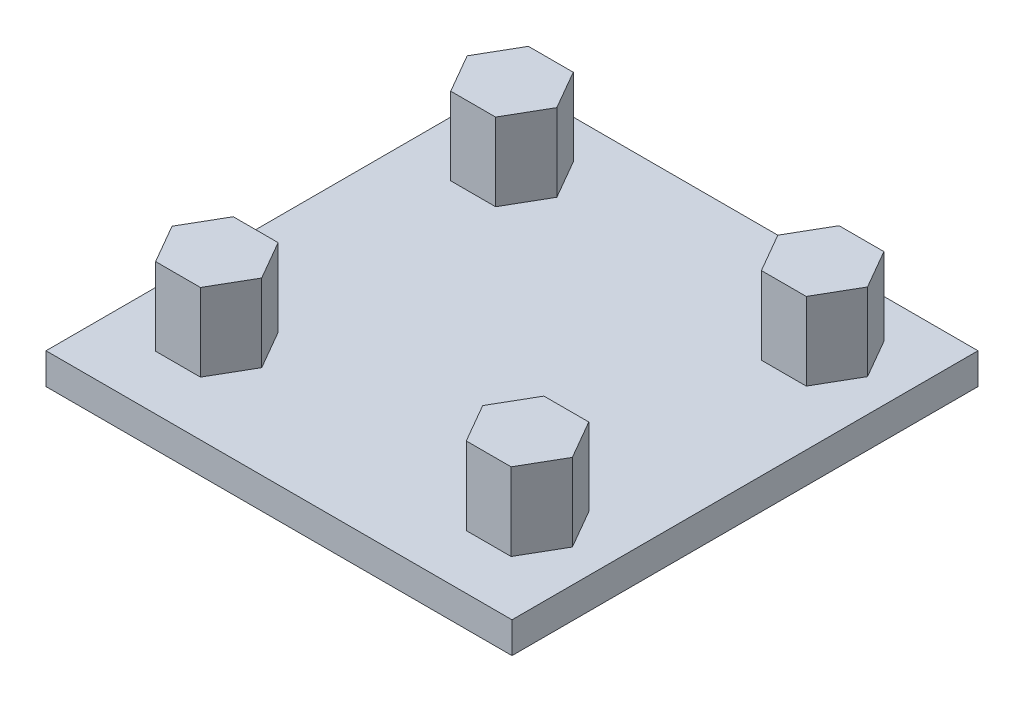
ISO-10303-21;
HEADER;
FILE_DESCRIPTION(('STEP AP214'),'2;1');
FILE_NAME('part.step','',(''),(''),'','','');
FILE_SCHEMA(('AUTOMOTIVE_DESIGN { 1 0 10303 214 1 1 1 1 }'));
ENDSEC;
DATA;
#1=APPLICATION_CONTEXT('core data for automotive mechanical design processes');
#2=APPLICATION_PROTOCOL_DEFINITION('international standard','automotive_design',2000,#1);
#3=PRODUCT_CONTEXT('',#1,'mechanical');
#4=PRODUCT('Part','Part','',(#3));
#5=PRODUCT_RELATED_PRODUCT_CATEGORY('part','',(#4));
#6=PRODUCT_DEFINITION_FORMATION('','',#4);
#7=PRODUCT_DEFINITION_CONTEXT('part definition',#1,'design');
#8=PRODUCT_DEFINITION('design','',#6,#7);
#9=PRODUCT_DEFINITION_SHAPE('','',#8);
#10=(LENGTH_UNIT() NAMED_UNIT(*) SI_UNIT(.MILLI.,.METRE.));
#11=(NAMED_UNIT(*) PLANE_ANGLE_UNIT() SI_UNIT($,.RADIAN.));
#12=(NAMED_UNIT(*) SI_UNIT($,.STERADIAN.) SOLID_ANGLE_UNIT());
#13=UNCERTAINTY_MEASURE_WITH_UNIT(LENGTH_MEASURE(1.E-05),#10,'distance_accuracy_value','');
#14=(GEOMETRIC_REPRESENTATION_CONTEXT(3) GLOBAL_UNCERTAINTY_ASSIGNED_CONTEXT((#13)) GLOBAL_UNIT_ASSIGNED_CONTEXT((#10,
#11,#12)) REPRESENTATION_CONTEXT('',''));
#15=CARTESIAN_POINT('',(0.,0.,0.));
#16=DIRECTION('',(0.,0.,1.));
#17=DIRECTION('',(1.,0.,0.));
#18=AXIS2_PLACEMENT_3D('',#15,#16,#17);
#19=CARTESIAN_POINT('',(50.8,17.78,48.26));
#20=DIRECTION('',(0.,1.,0.));
#21=DIRECTION('',(0.,0.,1.));
#22=AXIS2_PLACEMENT_3D('',#19,#20,#21);
#23=PLANE('',#22);
#24=DIRECTION('',(1.,0.,0.));
#25=VECTOR('',#24,1.);
#26=CARTESIAN_POINT('',(21.7338257906459,17.78,29.21));
#27=LINE('',#26,#25);
#28=CARTESIAN_POINT('',(21.7338257906459,17.78,29.21));
#29=VERTEX_POINT('',#28);
#30=CARTESIAN_POINT('',(29.0661742093541,17.78,29.21));
#31=VERTEX_POINT('',#30);
#32=EDGE_CURVE('E467',#29,#31,#27,.T.);
#33=ORIENTED_EDGE('',*,*,#32,.T.);
#34=DIRECTION('',(0.5,0.,-0.866025403784439));
#35=VECTOR('',#34,1.);
#36=CARTESIAN_POINT('',(29.0661742093541,17.78,29.21));
#37=LINE('',#36,#35);
#38=CARTESIAN_POINT('',(32.7323484187082,17.78,22.86));
#39=VERTEX_POINT('',#38);
#40=EDGE_CURVE('E479',#31,#39,#37,.T.);
#41=ORIENTED_EDGE('',*,*,#40,.T.);
#42=DIRECTION('',(-0.5,0.,-0.866025403784439));
#43=VECTOR('',#42,1.);
#44=CARTESIAN_POINT('',(32.7323484187082,17.78,22.86));
#45=LINE('',#44,#43);
#46=CARTESIAN_POINT('',(29.0661742093541,17.78,16.51));
#47=VERTEX_POINT('',#46);
#48=EDGE_CURVE('E487',#39,#47,#45,.T.);
#49=ORIENTED_EDGE('',*,*,#48,.T.);
#50=DIRECTION('',(-1.,0.,0.));
#51=VECTOR('',#50,1.);
#52=CARTESIAN_POINT('',(29.0661742093541,17.78,16.51));
#53=LINE('',#52,#51);
#54=CARTESIAN_POINT('',(21.7338257906459,17.78,16.51));
#55=VERTEX_POINT('',#54);
#56=EDGE_CURVE('E493',#47,#55,#53,.T.);
#57=ORIENTED_EDGE('',*,*,#56,.T.);
#58=DIRECTION('',(-0.5,0.,0.866025403784438));
#59=VECTOR('',#58,1.);
#60=CARTESIAN_POINT('',(21.7338257906459,17.78,16.51));
#61=LINE('',#60,#59);
#62=CARTESIAN_POINT('',(18.0676515812918,17.78,22.86));
#63=VERTEX_POINT('',#62);
#64=EDGE_CURVE('E51',#55,#63,#61,.T.);
#65=ORIENTED_EDGE('',*,*,#64,.T.);
#66=DIRECTION('',(0.5,0.,0.866025403784439));
#67=VECTOR('',#66,1.);
#68=CARTESIAN_POINT('',(18.0676515812918,17.78,22.86));
#69=LINE('',#68,#67);
#70=EDGE_CURVE('E11',#63,#29,#69,.T.);
#71=ORIENTED_EDGE('',*,*,#70,.T.);
#72=EDGE_LOOP('',(#33,#41,#49,#57,#65,#71));
#73=FACE_BOUND('',#72,.T.);
#74=ADVANCED_FACE('F43',(#73),#23,.T.);
#75=CARTESIAN_POINT('',(18.0676515812918,17.78,22.86));
#76=DIRECTION('',(0.866025403784439,0.,-0.5));
#77=DIRECTION('',(-0.5,0.,-0.866025403784439));
#78=AXIS2_PLACEMENT_3D('',#75,#76,#77);
#79=PLANE('',#78);
#80=DIRECTION('',(0.5,0.,0.866025403784439));
#81=VECTOR('',#80,1.);
#82=CARTESIAN_POINT('',(18.0676515812918,5.08,22.86));
#83=LINE('',#82,#81);
#84=CARTESIAN_POINT('',(18.0676515812918,5.08,22.86));
#85=VERTEX_POINT('',#84);
#86=CARTESIAN_POINT('',(21.7338257906459,5.08,29.21));
#87=VERTEX_POINT('',#86);
#88=EDGE_CURVE('E445',#85,#87,#83,.T.);
#89=ORIENTED_EDGE('',*,*,#88,.T.);
#90=DIRECTION('',(0.,-1.,0.));
#91=VECTOR('',#90,1.);
#92=CARTESIAN_POINT('',(21.7338257906459,17.78,29.21));
#93=LINE('',#92,#91);
#94=EDGE_CURVE('E471',#29,#87,#93,.T.);
#95=ORIENTED_EDGE('',*,*,#94,.F.);
#96=ORIENTED_EDGE('',*,*,#70,.F.);
#97=DIRECTION('',(0.,-1.,0.));
#98=VECTOR('',#97,1.);
#99=CARTESIAN_POINT('',(18.0676515812918,17.78,22.86));
#100=LINE('',#99,#98);
#101=EDGE_CURVE('E58',#63,#85,#100,.T.);
#102=ORIENTED_EDGE('',*,*,#101,.T.);
#103=EDGE_LOOP('',(#89,#95,#96,#102));
#104=FACE_BOUND('',#103,.T.);
#105=ADVANCED_FACE('F502',(#104),#79,.F.);
#106=CARTESIAN_POINT('',(21.7338257906459,17.78,16.51));
#107=DIRECTION('',(0.866025403784438,0.,0.5));
#108=DIRECTION('',(0.5,0.,-0.866025403784439));
#109=AXIS2_PLACEMENT_3D('',#106,#107,#108);
#110=PLANE('',#109);
#111=DIRECTION('',(-0.5,0.,0.866025403784438));
#112=VECTOR('',#111,1.);
#113=CARTESIAN_POINT('',(21.7338257906459,5.08,16.51));
#114=LINE('',#113,#112);
#115=CARTESIAN_POINT('',(21.7338257906459,5.08,16.51));
#116=VERTEX_POINT('',#115);
#117=EDGE_CURVE('E449',#116,#85,#114,.T.);
#118=ORIENTED_EDGE('',*,*,#117,.T.);
#119=ORIENTED_EDGE('',*,*,#101,.F.);
#120=ORIENTED_EDGE('',*,*,#64,.F.);
#121=DIRECTION('',(0.,-1.,0.));
#122=VECTOR('',#121,1.);
#123=CARTESIAN_POINT('',(21.7338257906459,17.78,16.51));
#124=LINE('',#123,#122);
#125=EDGE_CURVE('E66',#55,#116,#124,.T.);
#126=ORIENTED_EDGE('',*,*,#125,.T.);
#127=EDGE_LOOP('',(#118,#119,#120,#126));
#128=FACE_BOUND('',#127,.T.);
#129=ADVANCED_FACE('F514',(#128),#110,.F.);
#130=CARTESIAN_POINT('',(29.0661742093541,17.78,16.51));
#131=DIRECTION('',(0.,0.,1.));
#132=DIRECTION('',(1.,0.,0.));
#133=AXIS2_PLACEMENT_3D('',#130,#131,#132);
#134=PLANE('',#133);
#135=DIRECTION('',(-1.,0.,0.));
#136=VECTOR('',#135,1.);
#137=CARTESIAN_POINT('',(29.0661742093541,5.08,16.51));
#138=LINE('',#137,#136);
#139=CARTESIAN_POINT('',(29.0661742093541,5.08,16.51));
#140=VERTEX_POINT('',#139);
#141=EDGE_CURVE('E452',#140,#116,#138,.T.);
#142=ORIENTED_EDGE('',*,*,#141,.T.);
#143=ORIENTED_EDGE('',*,*,#125,.F.);
#144=ORIENTED_EDGE('',*,*,#56,.F.);
#145=DIRECTION('',(0.,-1.,0.));
#146=VECTOR('',#145,1.);
#147=CARTESIAN_POINT('',(29.0661742093541,17.78,16.51));
#148=LINE('',#147,#146);
#149=EDGE_CURVE('E483',#47,#140,#148,.T.);
#150=ORIENTED_EDGE('',*,*,#149,.T.);
#151=EDGE_LOOP('',(#142,#143,#144,#150));
#152=FACE_BOUND('',#151,.T.);
#153=ADVANCED_FACE('F512',(#152),#134,.F.);
#154=CARTESIAN_POINT('',(32.7323484187082,17.78,22.86));
#155=DIRECTION('',(-0.866025403784439,0.,0.5));
#156=DIRECTION('',(0.5,0.,0.866025403784439));
#157=AXIS2_PLACEMENT_3D('',#154,#155,#156);
#158=PLANE('',#157);
#159=DIRECTION('',(-0.5,0.,-0.866025403784439));
#160=VECTOR('',#159,1.);
#161=CARTESIAN_POINT('',(32.7323484187082,5.08,22.86));
#162=LINE('',#161,#160);
#163=CARTESIAN_POINT('',(32.7323484187082,5.08,22.86));
#164=VERTEX_POINT('',#163);
#165=EDGE_CURVE('E455',#164,#140,#162,.T.);
#166=ORIENTED_EDGE('',*,*,#165,.T.);
#167=ORIENTED_EDGE('',*,*,#149,.F.);
#168=ORIENTED_EDGE('',*,*,#48,.F.);
#169=DIRECTION('',(0.,-1.,0.));
#170=VECTOR('',#169,1.);
#171=CARTESIAN_POINT('',(32.7323484187082,17.78,22.86));
#172=LINE('',#171,#170);
#173=EDGE_CURVE('E475',#39,#164,#172,.T.);
#174=ORIENTED_EDGE('',*,*,#173,.T.);
#175=EDGE_LOOP('',(#166,#167,#168,#174));
#176=FACE_BOUND('',#175,.T.);
#177=ADVANCED_FACE('F511',(#176),#158,.F.);
#178=CARTESIAN_POINT('',(29.0661742093541,17.78,29.21));
#179=DIRECTION('',(-0.866025403784439,0.,-0.5));
#180=DIRECTION('',(-0.5,0.,0.866025403784439));
#181=AXIS2_PLACEMENT_3D('',#178,#179,#180);
#182=PLANE('',#181);
#183=DIRECTION('',(0.5,0.,-0.866025403784439));
#184=VECTOR('',#183,1.);
#185=CARTESIAN_POINT('',(29.0661742093541,5.08,29.21));
#186=LINE('',#185,#184);
#187=CARTESIAN_POINT('',(29.0661742093541,5.08,29.21));
#188=VERTEX_POINT('',#187);
#189=EDGE_CURVE('E459',#188,#164,#186,.T.);
#190=ORIENTED_EDGE('',*,*,#189,.T.);
#191=ORIENTED_EDGE('',*,*,#173,.F.);
#192=ORIENTED_EDGE('',*,*,#40,.F.);
#193=DIRECTION('',(0.,-1.,0.));
#194=VECTOR('',#193,1.);
#195=CARTESIAN_POINT('',(29.0661742093541,17.78,29.21));
#196=LINE('',#195,#194);
#197=EDGE_CURVE('E463',#31,#188,#196,.T.);
#198=ORIENTED_EDGE('',*,*,#197,.T.);
#199=EDGE_LOOP('',(#190,#191,#192,#198));
#200=FACE_BOUND('',#199,.T.);
#201=ADVANCED_FACE('F509',(#200),#182,.F.);
#202=CARTESIAN_POINT('',(21.7338257906459,17.78,29.21));
#203=DIRECTION('',(0.,0.,-1.));
#204=DIRECTION('',(-1.,0.,0.));
#205=AXIS2_PLACEMENT_3D('',#202,#203,#204);
#206=PLANE('',#205);
#207=DIRECTION('',(1.,0.,0.));
#208=VECTOR('',#207,1.);
#209=CARTESIAN_POINT('',(21.7338257906459,5.08,29.21));
#210=LINE('',#209,#208);
#211=EDGE_CURVE('E442',#87,#188,#210,.T.);
#212=ORIENTED_EDGE('',*,*,#211,.T.);
#213=ORIENTED_EDGE('',*,*,#197,.F.);
#214=ORIENTED_EDGE('',*,*,#32,.F.);
#215=ORIENTED_EDGE('',*,*,#94,.T.);
#216=EDGE_LOOP('',(#212,#213,#214,#215));
#217=FACE_BOUND('',#216,.T.);
#218=ADVANCED_FACE('F504',(#217),#206,.F.);
#219=CARTESIAN_POINT('',(0.,17.78,48.26));
#220=DIRECTION('',(0.,1.,0.));
#221=DIRECTION('',(0.,0.,1.));
#222=AXIS2_PLACEMENT_3D('',#219,#220,#221);
#223=PLANE('',#222);
#224=DIRECTION('',(1.,0.,0.));
#225=VECTOR('',#224,1.);
#226=CARTESIAN_POINT('',(-29.0661742093541,17.78,29.21));
#227=LINE('',#226,#225);
#228=CARTESIAN_POINT('',(-29.0661742093541,17.78,29.21));
#229=VERTEX_POINT('',#228);
#230=CARTESIAN_POINT('',(-21.7338257906459,17.78,29.21));
#231=VERTEX_POINT('',#230);
#232=EDGE_CURVE('E398',#229,#231,#227,.T.);
#233=ORIENTED_EDGE('',*,*,#232,.T.);
#234=DIRECTION('',(0.5,0.,-0.866025403784439));
#235=VECTOR('',#234,1.);
#236=CARTESIAN_POINT('',(-21.7338257906459,17.78,29.21));
#237=LINE('',#236,#235);
#238=CARTESIAN_POINT('',(-18.0676515812918,17.78,22.86));
#239=VERTEX_POINT('',#238);
#240=EDGE_CURVE('E410',#231,#239,#237,.T.);
#241=ORIENTED_EDGE('',*,*,#240,.T.);
#242=DIRECTION('',(-0.5,0.,-0.866025403784439));
#243=VECTOR('',#242,1.);
#244=CARTESIAN_POINT('',(-18.0676515812918,17.78,22.86));
#245=LINE('',#244,#243);
#246=CARTESIAN_POINT('',(-21.7338257906459,17.78,16.51));
#247=VERTEX_POINT('',#246);
#248=EDGE_CURVE('E418',#239,#247,#245,.T.);
#249=ORIENTED_EDGE('',*,*,#248,.T.);
#250=DIRECTION('',(-1.,0.,0.));
#251=VECTOR('',#250,1.);
#252=CARTESIAN_POINT('',(-21.7338257906459,17.78,16.51));
#253=LINE('',#252,#251);
#254=CARTESIAN_POINT('',(-29.0661742093541,17.78,16.51));
#255=VERTEX_POINT('',#254);
#256=EDGE_CURVE('E426',#247,#255,#253,.T.);
#257=ORIENTED_EDGE('',*,*,#256,.T.);
#258=DIRECTION('',(-0.5,0.,0.866025403784438));
#259=VECTOR('',#258,1.);
#260=CARTESIAN_POINT('',(-29.0661742093541,17.78,16.51));
#261=LINE('',#260,#259);
#262=CARTESIAN_POINT('',(-32.7323484187082,17.78,22.86));
#263=VERTEX_POINT('',#262);
#264=EDGE_CURVE('E434',#255,#263,#261,.T.);
#265=ORIENTED_EDGE('',*,*,#264,.T.);
#266=DIRECTION('',(0.5,0.,0.866025403784439));
#267=VECTOR('',#266,1.);
#268=CARTESIAN_POINT('',(-32.7323484187082,17.78,22.86));
#269=LINE('',#268,#267);
#270=EDGE_CURVE('E438',#263,#229,#269,.T.);
#271=ORIENTED_EDGE('',*,*,#270,.T.);
#272=EDGE_LOOP('',(#233,#241,#249,#257,#265,#271));
#273=FACE_BOUND('',#272,.T.);
#274=ADVANCED_FACE('F551',(#273),#223,.T.);
#275=CARTESIAN_POINT('',(-32.7323484187082,17.78,22.86));
#276=DIRECTION('',(0.866025403784439,0.,-0.5));
#277=DIRECTION('',(-0.5,0.,-0.866025403784439));
#278=AXIS2_PLACEMENT_3D('',#275,#276,#277);
#279=PLANE('',#278);
#280=DIRECTION('',(0.5,0.,0.866025403784439));
#281=VECTOR('',#280,1.);
#282=CARTESIAN_POINT('',(-32.7323484187082,5.08,22.86));
#283=LINE('',#282,#281);
#284=CARTESIAN_POINT('',(-32.7323484187082,5.08,22.86));
#285=VERTEX_POINT('',#284);
#286=CARTESIAN_POINT('',(-29.0661742093541,5.08,29.21));
#287=VERTEX_POINT('',#286);
#288=EDGE_CURVE('E374',#285,#287,#283,.T.);
#289=ORIENTED_EDGE('',*,*,#288,.T.);
#290=DIRECTION('',(0.,-1.,0.));
#291=VECTOR('',#290,1.);
#292=CARTESIAN_POINT('',(-29.0661742093541,17.78,29.21));
#293=LINE('',#292,#291);
#294=EDGE_CURVE('E402',#229,#287,#293,.T.);
#295=ORIENTED_EDGE('',*,*,#294,.F.);
#296=ORIENTED_EDGE('',*,*,#270,.F.);
#297=DIRECTION('',(0.,-1.,0.));
#298=VECTOR('',#297,1.);
#299=CARTESIAN_POINT('',(-32.7323484187082,17.78,22.86));
#300=LINE('',#299,#298);
#301=EDGE_CURVE('E430',#263,#285,#300,.T.);
#302=ORIENTED_EDGE('',*,*,#301,.T.);
#303=EDGE_LOOP('',(#289,#295,#296,#302));
#304=FACE_BOUND('',#303,.T.);
#305=ADVANCED_FACE('F554',(#304),#279,.F.);
#306=CARTESIAN_POINT('',(-29.0661742093541,17.78,16.51));
#307=DIRECTION('',(0.866025403784438,0.,0.5));
#308=DIRECTION('',(0.5,0.,-0.866025403784439));
#309=AXIS2_PLACEMENT_3D('',#306,#307,#308);
#310=PLANE('',#309);
#311=DIRECTION('',(-0.5,0.,0.866025403784438));
#312=VECTOR('',#311,1.);
#313=CARTESIAN_POINT('',(-29.0661742093541,5.08,16.51));
#314=LINE('',#313,#312);
#315=CARTESIAN_POINT('',(-29.0661742093541,5.08,16.51));
#316=VERTEX_POINT('',#315);
#317=EDGE_CURVE('E378',#316,#285,#314,.T.);
#318=ORIENTED_EDGE('',*,*,#317,.T.);
#319=ORIENTED_EDGE('',*,*,#301,.F.);
#320=ORIENTED_EDGE('',*,*,#264,.F.);
#321=DIRECTION('',(0.,-1.,0.));
#322=VECTOR('',#321,1.);
#323=CARTESIAN_POINT('',(-29.0661742093541,17.78,16.51));
#324=LINE('',#323,#322);
#325=EDGE_CURVE('E422',#255,#316,#324,.T.);
#326=ORIENTED_EDGE('',*,*,#325,.T.);
#327=EDGE_LOOP('',(#318,#319,#320,#326));
#328=FACE_BOUND('',#327,.T.);
#329=ADVANCED_FACE('F558',(#328),#310,.F.);
#330=CARTESIAN_POINT('',(-21.7338257906459,17.78,16.51));
#331=DIRECTION('',(0.,0.,1.));
#332=DIRECTION('',(1.,0.,0.));
#333=AXIS2_PLACEMENT_3D('',#330,#331,#332);
#334=PLANE('',#333);
#335=DIRECTION('',(-1.,0.,0.));
#336=VECTOR('',#335,1.);
#337=CARTESIAN_POINT('',(-21.7338257906459,5.08,16.51));
#338=LINE('',#337,#336);
#339=CARTESIAN_POINT('',(-21.7338257906459,5.08,16.51));
#340=VERTEX_POINT('',#339);
#341=EDGE_CURVE('E382',#340,#316,#338,.T.);
#342=ORIENTED_EDGE('',*,*,#341,.T.);
#343=ORIENTED_EDGE('',*,*,#325,.F.);
#344=ORIENTED_EDGE('',*,*,#256,.F.);
#345=DIRECTION('',(0.,-1.,0.));
#346=VECTOR('',#345,1.);
#347=CARTESIAN_POINT('',(-21.7338257906459,17.78,16.51));
#348=LINE('',#347,#346);
#349=EDGE_CURVE('E414',#247,#340,#348,.T.);
#350=ORIENTED_EDGE('',*,*,#349,.T.);
#351=EDGE_LOOP('',(#342,#343,#344,#350));
#352=FACE_BOUND('',#351,.T.);
#353=ADVANCED_FACE('F562',(#352),#334,.F.);
#354=CARTESIAN_POINT('',(-18.0676515812918,17.78,22.86));
#355=DIRECTION('',(-0.866025403784439,0.,0.5));
#356=DIRECTION('',(0.5,0.,0.866025403784439));
#357=AXIS2_PLACEMENT_3D('',#354,#355,#356);
#358=PLANE('',#357);
#359=DIRECTION('',(-0.5,0.,-0.866025403784439));
#360=VECTOR('',#359,1.);
#361=CARTESIAN_POINT('',(-18.0676515812918,5.08,22.86));
#362=LINE('',#361,#360);
#363=CARTESIAN_POINT('',(-18.0676515812918,5.08,22.86));
#364=VERTEX_POINT('',#363);
#365=EDGE_CURVE('E386',#364,#340,#362,.T.);
#366=ORIENTED_EDGE('',*,*,#365,.T.);
#367=ORIENTED_EDGE('',*,*,#349,.F.);
#368=ORIENTED_EDGE('',*,*,#248,.F.);
#369=DIRECTION('',(0.,-1.,0.));
#370=VECTOR('',#369,1.);
#371=CARTESIAN_POINT('',(-18.0676515812918,17.78,22.86));
#372=LINE('',#371,#370);
#373=EDGE_CURVE('E406',#239,#364,#372,.T.);
#374=ORIENTED_EDGE('',*,*,#373,.T.);
#375=EDGE_LOOP('',(#366,#367,#368,#374));
#376=FACE_BOUND('',#375,.T.);
#377=ADVANCED_FACE('F566',(#376),#358,.F.);
#378=CARTESIAN_POINT('',(-21.7338257906459,17.78,29.21));
#379=DIRECTION('',(-0.866025403784439,0.,-0.5));
#380=DIRECTION('',(-0.5,0.,0.866025403784439));
#381=AXIS2_PLACEMENT_3D('',#378,#379,#380);
#382=PLANE('',#381);
#383=DIRECTION('',(0.5,0.,-0.866025403784439));
#384=VECTOR('',#383,1.);
#385=CARTESIAN_POINT('',(-21.7338257906459,5.08,29.21));
#386=LINE('',#385,#384);
#387=CARTESIAN_POINT('',(-21.7338257906459,5.08,29.21));
#388=VERTEX_POINT('',#387);
#389=EDGE_CURVE('E390',#388,#364,#386,.T.);
#390=ORIENTED_EDGE('',*,*,#389,.T.);
#391=ORIENTED_EDGE('',*,*,#373,.F.);
#392=ORIENTED_EDGE('',*,*,#240,.F.);
#393=DIRECTION('',(0.,-1.,0.));
#394=VECTOR('',#393,1.);
#395=CARTESIAN_POINT('',(-21.7338257906459,17.78,29.21));
#396=LINE('',#395,#394);
#397=EDGE_CURVE('E394',#231,#388,#396,.T.);
#398=ORIENTED_EDGE('',*,*,#397,.T.);
#399=EDGE_LOOP('',(#390,#391,#392,#398));
#400=FACE_BOUND('',#399,.T.);
#401=ADVANCED_FACE('F528',(#400),#382,.F.);
#402=CARTESIAN_POINT('',(-29.0661742093541,17.78,29.21));
#403=DIRECTION('',(0.,0.,-1.));
#404=DIRECTION('',(-1.,0.,0.));
#405=AXIS2_PLACEMENT_3D('',#402,#403,#404);
#406=PLANE('',#405);
#407=DIRECTION('',(1.,0.,0.));
#408=VECTOR('',#407,1.);
#409=CARTESIAN_POINT('',(-29.0661742093541,5.08,29.21));
#410=LINE('',#409,#408);
#411=EDGE_CURVE('E371',#287,#388,#410,.T.);
#412=ORIENTED_EDGE('',*,*,#411,.T.);
#413=ORIENTED_EDGE('',*,*,#397,.F.);
#414=ORIENTED_EDGE('',*,*,#232,.F.);
#415=ORIENTED_EDGE('',*,*,#294,.T.);
#416=EDGE_LOOP('',(#412,#413,#414,#415));
#417=FACE_BOUND('',#416,.T.);
#418=ADVANCED_FACE('F518',(#417),#406,.F.);
#419=CARTESIAN_POINT('',(0.,5.08,0.));
#420=DIRECTION('',(0.,1.,0.));
#421=DIRECTION('',(0.,0.,1.));
#422=AXIS2_PLACEMENT_3D('',#419,#420,#421);
#423=PLANE('',#422);
#424=DIRECTION('',(0.,0.,-1.));
#425=VECTOR('',#424,1.);
#426=CARTESIAN_POINT('',(38.1,5.08,-38.1));
#427=LINE('',#426,#425);
#428=CARTESIAN_POINT('',(38.1,5.08,38.1));
#429=VERTEX_POINT('',#428);
#430=CARTESIAN_POINT('',(38.1,5.08,-38.1));
#431=VERTEX_POINT('',#430);
#432=EDGE_CURVE('E330',#429,#431,#427,.T.);
#433=ORIENTED_EDGE('',*,*,#432,.T.);
#434=DIRECTION('',(-1.,0.,0.));
#435=VECTOR('',#434,1.);
#436=CARTESIAN_POINT('',(-38.1,5.08,-38.1));
#437=LINE('',#436,#435);
#438=CARTESIAN_POINT('',(-38.1,5.08,-38.1));
#439=VERTEX_POINT('',#438);
#440=EDGE_CURVE('E334',#431,#439,#437,.T.);
#441=ORIENTED_EDGE('',*,*,#440,.T.);
#442=DIRECTION('',(0.,0.,1.));
#443=VECTOR('',#442,1.);
#444=CARTESIAN_POINT('',(-38.1,5.08,-38.1));
#445=LINE('',#444,#443);
#446=CARTESIAN_POINT('',(-38.1,5.08,38.1));
#447=VERTEX_POINT('',#446);
#448=EDGE_CURVE('E338',#439,#447,#445,.T.);
#449=ORIENTED_EDGE('',*,*,#448,.T.);
#450=DIRECTION('',(1.,0.,0.));
#451=VECTOR('',#450,1.);
#452=CARTESIAN_POINT('',(-38.1,5.08,38.1));
#453=LINE('',#452,#451);
#454=EDGE_CURVE('E341',#447,#429,#453,.T.);
#455=ORIENTED_EDGE('',*,*,#454,.T.);
#456=EDGE_LOOP('',(#433,#441,#449,#455));
#457=FACE_BOUND('',#456,.T.);
#458=DIRECTION('',(0.5,0.,-0.866025403784439));
#459=VECTOR('',#458,1.);
#460=CARTESIAN_POINT('',(-21.7338257906459,5.08,-19.05));
#461=LINE('',#460,#459);
#462=CARTESIAN_POINT('',(-21.7338257906459,5.08,-19.05));
#463=VERTEX_POINT('',#462);
#464=CARTESIAN_POINT('',(-18.0676515812918,5.08,-25.4));
#465=VERTEX_POINT('',#464);
#466=EDGE_CURVE('E293',#463,#465,#461,.T.);
#467=ORIENTED_EDGE('',*,*,#466,.F.);
#468=DIRECTION('',(1.,0.,0.));
#469=VECTOR('',#468,1.);
#470=CARTESIAN_POINT('',(-29.0661742093541,5.08,-19.05));
#471=LINE('',#470,#469);
#472=CARTESIAN_POINT('',(-29.0661742093541,5.08,-19.05));
#473=VERTEX_POINT('',#472);
#474=EDGE_CURVE('E264',#473,#463,#471,.T.);
#475=ORIENTED_EDGE('',*,*,#474,.F.);
#476=DIRECTION('',(0.5,0.,0.866025403784439));
#477=VECTOR('',#476,1.);
#478=CARTESIAN_POINT('',(-32.7323484187082,5.08,-25.4));
#479=LINE('',#478,#477);
#480=CARTESIAN_POINT('',(-32.7323484187082,5.08,-25.4));
#481=VERTEX_POINT('',#480);
#482=EDGE_CURVE('E274',#481,#473,#479,.T.);
#483=ORIENTED_EDGE('',*,*,#482,.F.);
#484=DIRECTION('',(-0.5,0.,0.866025403784438));
#485=VECTOR('',#484,1.);
#486=CARTESIAN_POINT('',(-29.0661742093541,5.08,-31.75));
#487=LINE('',#486,#485);
#488=CARTESIAN_POINT('',(-29.0661742093541,5.08,-31.75));
#489=VERTEX_POINT('',#488);
#490=EDGE_CURVE('E302',#489,#481,#487,.T.);
#491=ORIENTED_EDGE('',*,*,#490,.F.);
#492=DIRECTION('',(-1.,0.,0.));
#493=VECTOR('',#492,1.);
#494=CARTESIAN_POINT('',(-21.7338257906459,5.08,-31.75));
#495=LINE('',#494,#493);
#496=CARTESIAN_POINT('',(-21.7338257906459,5.08,-31.75));
#497=VERTEX_POINT('',#496);
#498=EDGE_CURVE('E299',#497,#489,#495,.T.);
#499=ORIENTED_EDGE('',*,*,#498,.F.);
#500=DIRECTION('',(-0.5,0.,-0.866025403784439));
#501=VECTOR('',#500,1.);
#502=CARTESIAN_POINT('',(-18.0676515812918,5.08,-25.4));
#503=LINE('',#502,#501);
#504=EDGE_CURVE('E296',#465,#497,#503,.T.);
#505=ORIENTED_EDGE('',*,*,#504,.F.);
#506=EDGE_LOOP('',(#467,#475,#483,#491,#499,#505));
#507=FACE_BOUND('',#506,.T.);
#508=DIRECTION('',(0.5,0.,-0.866025403784439));
#509=VECTOR('',#508,1.);
#510=CARTESIAN_POINT('',(29.0661742093541,5.08,-19.05));
#511=LINE('',#510,#509);
#512=CARTESIAN_POINT('',(29.0661742093541,5.08,-19.05));
#513=VERTEX_POINT('',#512);
#514=CARTESIAN_POINT('',(32.7323484187082,5.08,-25.4));
#515=VERTEX_POINT('',#514);
#516=EDGE_CURVE('E260',#513,#515,#511,.T.);
#517=ORIENTED_EDGE('',*,*,#516,.F.);
#518=DIRECTION('',(1.,0.,0.));
#519=VECTOR('',#518,1.);
#520=CARTESIAN_POINT('',(21.7338257906459,5.08,-19.05));
#521=LINE('',#520,#519);
#522=CARTESIAN_POINT('',(21.7338257906459,5.08,-19.05));
#523=VERTEX_POINT('',#522);
#524=EDGE_CURVE('E257',#523,#513,#521,.T.);
#525=ORIENTED_EDGE('',*,*,#524,.F.);
#526=DIRECTION('',(0.5,0.,0.866025403784439));
#527=VECTOR('',#526,1.);
#528=CARTESIAN_POINT('',(18.0676515812918,5.08,-25.4));
#529=LINE('',#528,#527);
#530=CARTESIAN_POINT('',(18.0676515812918,5.08,-25.4));
#531=VERTEX_POINT('',#530);
#532=EDGE_CURVE('E243',#531,#523,#529,.T.);
#533=ORIENTED_EDGE('',*,*,#532,.F.);
#534=DIRECTION('',(-0.5,0.,0.866025403784438));
#535=VECTOR('',#534,1.);
#536=CARTESIAN_POINT('',(21.7338257906459,5.08,-31.75));
#537=LINE('',#536,#535);
#538=CARTESIAN_POINT('',(21.7338257906459,5.08,-31.75));
#539=VERTEX_POINT('',#538);
#540=EDGE_CURVE('E943',#539,#531,#537,.T.);
#541=ORIENTED_EDGE('',*,*,#540,.F.);
#542=DIRECTION('',(-1.,0.,0.));
#543=VECTOR('',#542,1.);
#544=CARTESIAN_POINT('',(29.0661742093541,5.08,-31.75));
#545=LINE('',#544,#543);
#546=CARTESIAN_POINT('',(29.0661742093541,5.08,-31.75));
#547=VERTEX_POINT('',#546);
#548=EDGE_CURVE('E929',#547,#539,#545,.T.);
#549=ORIENTED_EDGE('',*,*,#548,.F.);
#550=DIRECTION('',(-0.5,0.,-0.866025403784439));
#551=VECTOR('',#550,1.);
#552=CARTESIAN_POINT('',(32.7323484187082,5.08,-25.4));
#553=LINE('',#552,#551);
#554=EDGE_CURVE('E927',#515,#547,#553,.T.);
#555=ORIENTED_EDGE('',*,*,#554,.F.);
#556=EDGE_LOOP('',(#517,#525,#533,#541,#549,#555));
#557=FACE_BOUND('',#556,.T.);
#558=ORIENTED_EDGE('',*,*,#411,.F.);
#559=ORIENTED_EDGE('',*,*,#288,.F.);
#560=ORIENTED_EDGE('',*,*,#317,.F.);
#561=ORIENTED_EDGE('',*,*,#341,.F.);
#562=ORIENTED_EDGE('',*,*,#365,.F.);
#563=ORIENTED_EDGE('',*,*,#389,.F.);
#564=EDGE_LOOP('',(#558,#559,#560,#561,#562,#563));
#565=FACE_BOUND('',#564,.T.);
#566=ORIENTED_EDGE('',*,*,#211,.F.);
#567=ORIENTED_EDGE('',*,*,#88,.F.);
#568=ORIENTED_EDGE('',*,*,#117,.F.);
#569=ORIENTED_EDGE('',*,*,#141,.F.);
#570=ORIENTED_EDGE('',*,*,#165,.F.);
#571=ORIENTED_EDGE('',*,*,#189,.F.);
#572=EDGE_LOOP('',(#566,#567,#568,#569,#570,#571));
#573=FACE_BOUND('',#572,.T.);
#574=ADVANCED_FACE('F515',(#457,#507,#557,#565,#573),#423,.T.);
#575=CARTESIAN_POINT('',(38.1,5.08,-38.1));
#576=DIRECTION('',(-1.,0.,0.));
#577=DIRECTION('',(0.,0.,1.));
#578=AXIS2_PLACEMENT_3D('',#575,#576,#577);
#579=PLANE('',#578);
#580=DIRECTION('',(0.,0.,-1.));
#581=VECTOR('',#580,1.);
#582=CARTESIAN_POINT('',(38.1,0.,-38.1));
#583=LINE('',#582,#581);
#584=CARTESIAN_POINT('',(38.1,0.,38.1));
#585=VERTEX_POINT('',#584);
#586=CARTESIAN_POINT('',(38.1,0.,-38.1));
#587=VERTEX_POINT('',#586);
#588=EDGE_CURVE('E329',#585,#587,#583,.T.);
#589=ORIENTED_EDGE('',*,*,#588,.T.);
#590=DIRECTION('',(0.,-1.,0.));
#591=VECTOR('',#590,1.);
#592=CARTESIAN_POINT('',(38.1,5.08,-38.1));
#593=LINE('',#592,#591);
#594=EDGE_CURVE('E367',#431,#587,#593,.T.);
#595=ORIENTED_EDGE('',*,*,#594,.F.);
#596=ORIENTED_EDGE('',*,*,#432,.F.);
#597=DIRECTION('',(0.,-1.,0.));
#598=VECTOR('',#597,1.);
#599=CARTESIAN_POINT('',(38.1,5.08,38.1));
#600=LINE('',#599,#598);
#601=EDGE_CURVE('E344',#429,#585,#600,.T.);
#602=ORIENTED_EDGE('',*,*,#601,.T.);
#603=EDGE_LOOP('',(#589,#595,#596,#602));
#604=FACE_BOUND('',#603,.T.);
#605=ADVANCED_FACE('F517',(#604),#579,.F.);
#606=CARTESIAN_POINT('',(-38.1,5.08,-38.1));
#607=DIRECTION('',(0.,0.,1.));
#608=DIRECTION('',(1.,0.,0.));
#609=AXIS2_PLACEMENT_3D('',#606,#607,#608);
#610=PLANE('',#609);
#611=DIRECTION('',(-1.,0.,0.));
#612=VECTOR('',#611,1.);
#613=CARTESIAN_POINT('',(-38.1,0.,-38.1));
#614=LINE('',#613,#612);
#615=CARTESIAN_POINT('',(-38.1,0.,-38.1));
#616=VERTEX_POINT('',#615);
#617=EDGE_CURVE('E348',#587,#616,#614,.T.);
#618=ORIENTED_EDGE('',*,*,#617,.T.);
#619=DIRECTION('',(0.,-1.,0.));
#620=VECTOR('',#619,1.);
#621=CARTESIAN_POINT('',(-38.1,5.08,-38.1));
#622=LINE('',#621,#620);
#623=EDGE_CURVE('E363',#439,#616,#622,.T.);
#624=ORIENTED_EDGE('',*,*,#623,.F.);
#625=ORIENTED_EDGE('',*,*,#440,.F.);
#626=ORIENTED_EDGE('',*,*,#594,.T.);
#627=EDGE_LOOP('',(#618,#624,#625,#626));
#628=FACE_BOUND('',#627,.T.);
#629=ADVANCED_FACE('F525',(#628),#610,.F.);
#630=CARTESIAN_POINT('',(-38.1,5.08,-38.1));
#631=DIRECTION('',(1.,0.,0.));
#632=DIRECTION('',(0.,0.,-1.));
#633=AXIS2_PLACEMENT_3D('',#630,#631,#632);
#634=PLANE('',#633);
#635=DIRECTION('',(0.,0.,1.));
#636=VECTOR('',#635,1.);
#637=CARTESIAN_POINT('',(-38.1,0.,-38.1));
#638=LINE('',#637,#636);
#639=CARTESIAN_POINT('',(-38.1,0.,38.1));
#640=VERTEX_POINT('',#639);
#641=EDGE_CURVE('E351',#616,#640,#638,.T.);
#642=ORIENTED_EDGE('',*,*,#641,.T.);
#643=DIRECTION('',(0.,-1.,0.));
#644=VECTOR('',#643,1.);
#645=CARTESIAN_POINT('',(-38.1,5.08,38.1));
#646=LINE('',#645,#644);
#647=EDGE_CURVE('E359',#447,#640,#646,.T.);
#648=ORIENTED_EDGE('',*,*,#647,.F.);
#649=ORIENTED_EDGE('',*,*,#448,.F.);
#650=ORIENTED_EDGE('',*,*,#623,.T.);
#651=EDGE_LOOP('',(#642,#648,#649,#650));
#652=FACE_BOUND('',#651,.T.);
#653=ADVANCED_FACE('F576',(#652),#634,.F.);
#654=CARTESIAN_POINT('',(-38.1,5.08,38.1));
#655=DIRECTION('',(0.,0.,-1.));
#656=DIRECTION('',(-1.,0.,0.));
#657=AXIS2_PLACEMENT_3D('',#654,#655,#656);
#658=PLANE('',#657);
#659=DIRECTION('',(1.,0.,0.));
#660=VECTOR('',#659,1.);
#661=CARTESIAN_POINT('',(-38.1,0.,38.1));
#662=LINE('',#661,#660);
#663=EDGE_CURVE('E335',#640,#585,#662,.T.);
#664=ORIENTED_EDGE('',*,*,#663,.T.);
#665=ORIENTED_EDGE('',*,*,#601,.F.);
#666=ORIENTED_EDGE('',*,*,#454,.F.);
#667=ORIENTED_EDGE('',*,*,#647,.T.);
#668=EDGE_LOOP('',(#664,#665,#666,#667));
#669=FACE_BOUND('',#668,.T.);
#670=ADVANCED_FACE('F580',(#669),#658,.F.);
#671=CARTESIAN_POINT('',(0.,0.,0.));
#672=DIRECTION('',(0.,1.,0.));
#673=DIRECTION('',(0.,0.,1.));
#674=AXIS2_PLACEMENT_3D('',#671,#672,#673);
#675=PLANE('',#674);
#676=ORIENTED_EDGE('',*,*,#588,.F.);
#677=ORIENTED_EDGE('',*,*,#663,.F.);
#678=ORIENTED_EDGE('',*,*,#641,.F.);
#679=ORIENTED_EDGE('',*,*,#617,.F.);
#680=EDGE_LOOP('',(#676,#677,#678,#679));
#681=FACE_BOUND('',#680,.T.);
#682=ADVANCED_FACE('F583',(#681),#675,.F.);
#683=CARTESIAN_POINT('',(-29.0661742093541,17.78,-19.05));
#684=DIRECTION('',(0.,0.,-1.));
#685=DIRECTION('',(-1.,0.,0.));
#686=AXIS2_PLACEMENT_3D('',#683,#684,#685);
#687=PLANE('',#686);
#688=ORIENTED_EDGE('',*,*,#474,.T.);
#689=DIRECTION('',(0.,-1.,0.));
#690=VECTOR('',#689,1.);
#691=CARTESIAN_POINT('',(-21.7338257906459,17.78,-19.05));
#692=LINE('',#691,#690);
#693=CARTESIAN_POINT('',(-21.7338257906459,17.78,-19.05));
#694=VERTEX_POINT('',#693);
#695=EDGE_CURVE('E326',#694,#463,#692,.T.);
#696=ORIENTED_EDGE('',*,*,#695,.F.);
#697=DIRECTION('',(1.,0.,0.));
#698=VECTOR('',#697,1.);
#699=CARTESIAN_POINT('',(-29.0661742093541,17.78,-19.05));
#700=LINE('',#699,#698);
#701=CARTESIAN_POINT('',(-29.0661742093541,17.78,-19.05));
#702=VERTEX_POINT('',#701);
#703=EDGE_CURVE('E269',#702,#694,#700,.T.);
#704=ORIENTED_EDGE('',*,*,#703,.F.);
#705=DIRECTION('',(0.,-1.,0.));
#706=VECTOR('',#705,1.);
#707=CARTESIAN_POINT('',(-29.0661742093541,17.78,-19.05));
#708=LINE('',#707,#706);
#709=EDGE_CURVE('E289',#702,#473,#708,.T.);
#710=ORIENTED_EDGE('',*,*,#709,.T.);
#711=EDGE_LOOP('',(#688,#696,#704,#710));
#712=FACE_BOUND('',#711,.T.);
#713=ADVANCED_FACE('F586',(#712),#687,.F.);
#714=CARTESIAN_POINT('',(-21.7338257906459,17.78,-19.05));
#715=DIRECTION('',(-0.866025403784439,0.,-0.5));
#716=DIRECTION('',(-0.5,0.,0.866025403784439));
#717=AXIS2_PLACEMENT_3D('',#714,#715,#716);
#718=PLANE('',#717);
#719=ORIENTED_EDGE('',*,*,#466,.T.);
#720=DIRECTION('',(0.,-1.,0.));
#721=VECTOR('',#720,1.);
#722=CARTESIAN_POINT('',(-18.0676515812918,17.78,-25.4));
#723=LINE('',#722,#721);
#724=CARTESIAN_POINT('',(-18.0676515812918,17.78,-25.4));
#725=VERTEX_POINT('',#724);
#726=EDGE_CURVE('E322',#725,#465,#723,.T.);
#727=ORIENTED_EDGE('',*,*,#726,.F.);
#728=DIRECTION('',(0.5,0.,-0.866025403784439));
#729=VECTOR('',#728,1.);
#730=CARTESIAN_POINT('',(-21.7338257906459,17.78,-19.05));
#731=LINE('',#730,#729);
#732=EDGE_CURVE('E273',#694,#725,#731,.T.);
#733=ORIENTED_EDGE('',*,*,#732,.F.);
#734=ORIENTED_EDGE('',*,*,#695,.T.);
#735=EDGE_LOOP('',(#719,#727,#733,#734));
#736=FACE_BOUND('',#735,.T.);
#737=ADVANCED_FACE('F591',(#736),#718,.F.);
#738=CARTESIAN_POINT('',(-18.0676515812918,17.78,-25.4));
#739=DIRECTION('',(-0.866025403784439,0.,0.5));
#740=DIRECTION('',(0.5,0.,0.866025403784439));
#741=AXIS2_PLACEMENT_3D('',#738,#739,#740);
#742=PLANE('',#741);
#743=ORIENTED_EDGE('',*,*,#504,.T.);
#744=DIRECTION('',(0.,-1.,0.));
#745=VECTOR('',#744,1.);
#746=CARTESIAN_POINT('',(-21.7338257906459,17.78,-31.75));
#747=LINE('',#746,#745);
#748=CARTESIAN_POINT('',(-21.7338257906459,17.78,-31.75));
#749=VERTEX_POINT('',#748);
#750=EDGE_CURVE('E318',#749,#497,#747,.T.);
#751=ORIENTED_EDGE('',*,*,#750,.F.);
#752=DIRECTION('',(-0.5,0.,-0.866025403784439));
#753=VECTOR('',#752,1.);
#754=CARTESIAN_POINT('',(-18.0676515812918,17.78,-25.4));
#755=LINE('',#754,#753);
#756=EDGE_CURVE('E277',#725,#749,#755,.T.);
#757=ORIENTED_EDGE('',*,*,#756,.F.);
#758=ORIENTED_EDGE('',*,*,#726,.T.);
#759=EDGE_LOOP('',(#743,#751,#757,#758));
#760=FACE_BOUND('',#759,.T.);
#761=ADVANCED_FACE('F606',(#760),#742,.F.);
#762=CARTESIAN_POINT('',(-21.7338257906459,17.78,-31.75));
#763=DIRECTION('',(0.,0.,1.));
#764=DIRECTION('',(1.,0.,0.));
#765=AXIS2_PLACEMENT_3D('',#762,#763,#764);
#766=PLANE('',#765);
#767=ORIENTED_EDGE('',*,*,#498,.T.);
#768=DIRECTION('',(0.,-1.,0.));
#769=VECTOR('',#768,1.);
#770=CARTESIAN_POINT('',(-29.0661742093541,17.78,-31.75));
#771=LINE('',#770,#769);
#772=CARTESIAN_POINT('',(-29.0661742093541,17.78,-31.75));
#773=VERTEX_POINT('',#772);
#774=EDGE_CURVE('E314',#773,#489,#771,.T.);
#775=ORIENTED_EDGE('',*,*,#774,.F.);
#776=DIRECTION('',(-1.,0.,0.));
#777=VECTOR('',#776,1.);
#778=CARTESIAN_POINT('',(-21.7338257906459,17.78,-31.75));
#779=LINE('',#778,#777);
#780=EDGE_CURVE('E280',#749,#773,#779,.T.);
#781=ORIENTED_EDGE('',*,*,#780,.F.);
#782=ORIENTED_EDGE('',*,*,#750,.T.);
#783=EDGE_LOOP('',(#767,#775,#781,#782));
#784=FACE_BOUND('',#783,.T.);
#785=ADVANCED_FACE('F612',(#784),#766,.F.);
#786=CARTESIAN_POINT('',(-29.0661742093541,17.78,-31.75));
#787=DIRECTION('',(0.866025403784438,0.,0.5));
#788=DIRECTION('',(0.5,0.,-0.866025403784439));
#789=AXIS2_PLACEMENT_3D('',#786,#787,#788);
#790=PLANE('',#789);
#791=ORIENTED_EDGE('',*,*,#490,.T.);
#792=DIRECTION('',(0.,-1.,0.));
#793=VECTOR('',#792,1.);
#794=CARTESIAN_POINT('',(-32.7323484187082,17.78,-25.4));
#795=LINE('',#794,#793);
#796=CARTESIAN_POINT('',(-32.7323484187082,17.78,-25.4));
#797=VERTEX_POINT('',#796);
#798=EDGE_CURVE('E311',#797,#481,#795,.T.);
#799=ORIENTED_EDGE('',*,*,#798,.F.);
#800=DIRECTION('',(-0.5,0.,0.866025403784438));
#801=VECTOR('',#800,1.);
#802=CARTESIAN_POINT('',(-29.0661742093541,17.78,-31.75));
#803=LINE('',#802,#801);
#804=EDGE_CURVE('E283',#773,#797,#803,.T.);
#805=ORIENTED_EDGE('',*,*,#804,.F.);
#806=ORIENTED_EDGE('',*,*,#774,.T.);
#807=EDGE_LOOP('',(#791,#799,#805,#806));
#808=FACE_BOUND('',#807,.T.);
#809=ADVANCED_FACE('F616',(#808),#790,.F.);
#810=CARTESIAN_POINT('',(-32.7323484187082,17.78,-25.4));
#811=DIRECTION('',(0.866025403784439,0.,-0.5));
#812=DIRECTION('',(-0.5,0.,-0.866025403784439));
#813=AXIS2_PLACEMENT_3D('',#810,#811,#812);
#814=PLANE('',#813);
#815=ORIENTED_EDGE('',*,*,#482,.T.);
#816=ORIENTED_EDGE('',*,*,#709,.F.);
#817=DIRECTION('',(0.5,0.,0.866025403784439));
#818=VECTOR('',#817,1.);
#819=CARTESIAN_POINT('',(-32.7323484187082,17.78,-25.4));
#820=LINE('',#819,#818);
#821=EDGE_CURVE('E286',#797,#702,#820,.T.);
#822=ORIENTED_EDGE('',*,*,#821,.F.);
#823=ORIENTED_EDGE('',*,*,#798,.T.);
#824=EDGE_LOOP('',(#815,#816,#822,#823));
#825=FACE_BOUND('',#824,.T.);
#826=ADVANCED_FACE('F620',(#825),#814,.F.);
#827=CARTESIAN_POINT('',(0.,17.78,0.));
#828=DIRECTION('',(0.,1.,0.));
#829=DIRECTION('',(0.,0.,1.));
#830=AXIS2_PLACEMENT_3D('',#827,#828,#829);
#831=PLANE('',#830);
#832=ORIENTED_EDGE('',*,*,#703,.T.);
#833=ORIENTED_EDGE('',*,*,#732,.T.);
#834=ORIENTED_EDGE('',*,*,#756,.T.);
#835=ORIENTED_EDGE('',*,*,#780,.T.);
#836=ORIENTED_EDGE('',*,*,#804,.T.);
#837=ORIENTED_EDGE('',*,*,#821,.T.);
#838=EDGE_LOOP('',(#832,#833,#834,#835,#836,#837));
#839=FACE_BOUND('',#838,.T.);
#840=ADVANCED_FACE('F624',(#839),#831,.T.);
#841=CARTESIAN_POINT('',(21.7338257906459,17.78,-19.05));
#842=DIRECTION('',(0.,0.,-1.));
#843=DIRECTION('',(-1.,0.,0.));
#844=AXIS2_PLACEMENT_3D('',#841,#842,#843);
#845=PLANE('',#844);
#846=ORIENTED_EDGE('',*,*,#524,.T.);
#847=DIRECTION('',(0.,-1.,0.));
#848=VECTOR('',#847,1.);
#849=CARTESIAN_POINT('',(29.0661742093541,17.78,-19.05));
#850=LINE('',#849,#848);
#851=CARTESIAN_POINT('',(29.0661742093541,17.78,-19.05));
#852=VERTEX_POINT('',#851);
#853=EDGE_CURVE('E249',#852,#513,#850,.T.);
#854=ORIENTED_EDGE('',*,*,#853,.F.);
#855=DIRECTION('',(1.,0.,0.));
#856=VECTOR('',#855,1.);
#857=CARTESIAN_POINT('',(21.7338257906459,17.78,-19.05));
#858=LINE('',#857,#856);
#859=CARTESIAN_POINT('',(21.7338257906459,17.78,-19.05));
#860=VERTEX_POINT('',#859);
#861=EDGE_CURVE('E231',#860,#852,#858,.T.);
#862=ORIENTED_EDGE('',*,*,#861,.F.);
#863=DIRECTION('',(0.,-1.,0.));
#864=VECTOR('',#863,1.);
#865=CARTESIAN_POINT('',(21.7338257906459,17.78,-19.05));
#866=LINE('',#865,#864);
#867=EDGE_CURVE('E914',#860,#523,#866,.T.);
#868=ORIENTED_EDGE('',*,*,#867,.T.);
#869=EDGE_LOOP('',(#846,#854,#862,#868));
#870=FACE_BOUND('',#869,.T.);
#871=ADVANCED_FACE('F255',(#870),#845,.F.);
#872=CARTESIAN_POINT('',(29.0661742093541,17.78,-19.05));
#873=DIRECTION('',(-0.866025403784439,0.,-0.5));
#874=DIRECTION('',(-0.5,0.,0.866025403784439));
#875=AXIS2_PLACEMENT_3D('',#872,#873,#874);
#876=PLANE('',#875);
#877=ORIENTED_EDGE('',*,*,#516,.T.);
#878=DIRECTION('',(0.,-1.,0.));
#879=VECTOR('',#878,1.);
#880=CARTESIAN_POINT('',(32.7323484187082,17.78,-25.4));
#881=LINE('',#880,#879);
#882=CARTESIAN_POINT('',(32.7323484187082,17.78,-25.4));
#883=VERTEX_POINT('',#882);
#884=EDGE_CURVE('E251',#883,#515,#881,.T.);
#885=ORIENTED_EDGE('',*,*,#884,.F.);
#886=DIRECTION('',(0.5,0.,-0.866025403784439));
#887=VECTOR('',#886,1.);
#888=CARTESIAN_POINT('',(29.0661742093541,17.78,-19.05));
#889=LINE('',#888,#887);
#890=EDGE_CURVE('E234',#852,#883,#889,.T.);
#891=ORIENTED_EDGE('',*,*,#890,.F.);
#892=ORIENTED_EDGE('',*,*,#853,.T.);
#893=EDGE_LOOP('',(#877,#885,#891,#892));
#894=FACE_BOUND('',#893,.T.);
#895=ADVANCED_FACE('F248',(#894),#876,.F.);
#896=CARTESIAN_POINT('',(32.7323484187082,17.78,-25.4));
#897=DIRECTION('',(-0.866025403784439,0.,0.5));
#898=DIRECTION('',(0.5,0.,0.866025403784439));
#899=AXIS2_PLACEMENT_3D('',#896,#897,#898);
#900=PLANE('',#899);
#901=ORIENTED_EDGE('',*,*,#554,.T.);
#902=DIRECTION('',(0.,-1.,0.));
#903=VECTOR('',#902,1.);
#904=CARTESIAN_POINT('',(29.0661742093541,17.78,-31.75));
#905=LINE('',#904,#903);
#906=CARTESIAN_POINT('',(29.0661742093541,17.78,-31.75));
#907=VERTEX_POINT('',#906);
#908=EDGE_CURVE('E932',#907,#547,#905,.T.);
#909=ORIENTED_EDGE('',*,*,#908,.F.);
#910=DIRECTION('',(-0.5,0.,-0.866025403784439));
#911=VECTOR('',#910,1.);
#912=CARTESIAN_POINT('',(32.7323484187082,17.78,-25.4));
#913=LINE('',#912,#911);
#914=EDGE_CURVE('E253',#883,#907,#913,.T.);
#915=ORIENTED_EDGE('',*,*,#914,.F.);
#916=ORIENTED_EDGE('',*,*,#884,.T.);
#917=EDGE_LOOP('',(#901,#909,#915,#916));
#918=FACE_BOUND('',#917,.T.);
#919=ADVANCED_FACE('F633',(#918),#900,.F.);
#920=CARTESIAN_POINT('',(29.0661742093541,17.78,-31.75));
#921=DIRECTION('',(0.,0.,1.));
#922=DIRECTION('',(1.,0.,0.));
#923=AXIS2_PLACEMENT_3D('',#920,#921,#922);
#924=PLANE('',#923);
#925=ORIENTED_EDGE('',*,*,#548,.T.);
#926=DIRECTION('',(0.,-1.,0.));
#927=VECTOR('',#926,1.);
#928=CARTESIAN_POINT('',(21.7338257906459,17.78,-31.75));
#929=LINE('',#928,#927);
#930=CARTESIAN_POINT('',(21.7338257906459,17.78,-31.75));
#931=VERTEX_POINT('',#930);
#932=EDGE_CURVE('E940',#931,#539,#929,.T.);
#933=ORIENTED_EDGE('',*,*,#932,.F.);
#934=DIRECTION('',(-1.,0.,0.));
#935=VECTOR('',#934,1.);
#936=CARTESIAN_POINT('',(29.0661742093541,17.78,-31.75));
#937=LINE('',#936,#935);
#938=EDGE_CURVE('E953',#907,#931,#937,.T.);
#939=ORIENTED_EDGE('',*,*,#938,.F.);
#940=ORIENTED_EDGE('',*,*,#908,.T.);
#941=EDGE_LOOP('',(#925,#933,#939,#940));
#942=FACE_BOUND('',#941,.T.);
#943=ADVANCED_FACE('F636',(#942),#924,.F.);
#944=CARTESIAN_POINT('',(21.7338257906459,17.78,-31.75));
#945=DIRECTION('',(0.866025403784438,0.,0.5));
#946=DIRECTION('',(0.5,0.,-0.866025403784439));
#947=AXIS2_PLACEMENT_3D('',#944,#945,#946);
#948=PLANE('',#947);
#949=ORIENTED_EDGE('',*,*,#540,.T.);
#950=DIRECTION('',(0.,-1.,0.));
#951=VECTOR('',#950,1.);
#952=CARTESIAN_POINT('',(18.0676515812918,17.78,-25.4));
#953=LINE('',#952,#951);
#954=CARTESIAN_POINT('',(18.0676515812918,17.78,-25.4));
#955=VERTEX_POINT('',#954);
#956=EDGE_CURVE('E916',#955,#531,#953,.T.);
#957=ORIENTED_EDGE('',*,*,#956,.F.);
#958=DIRECTION('',(-0.5,0.,0.866025403784438));
#959=VECTOR('',#958,1.);
#960=CARTESIAN_POINT('',(21.7338257906459,17.78,-31.75));
#961=LINE('',#960,#959);
#962=EDGE_CURVE('E950',#931,#955,#961,.T.);
#963=ORIENTED_EDGE('',*,*,#962,.F.);
#964=ORIENTED_EDGE('',*,*,#932,.T.);
#965=EDGE_LOOP('',(#949,#957,#963,#964));
#966=FACE_BOUND('',#965,.T.);
#967=ADVANCED_FACE('F640',(#966),#948,.F.);
#968=CARTESIAN_POINT('',(18.0676515812918,17.78,-25.4));
#969=DIRECTION('',(0.866025403784439,0.,-0.5));
#970=DIRECTION('',(-0.5,0.,-0.866025403784439));
#971=AXIS2_PLACEMENT_3D('',#968,#969,#970);
#972=PLANE('',#971);
#973=ORIENTED_EDGE('',*,*,#532,.T.);
#974=ORIENTED_EDGE('',*,*,#867,.F.);
#975=DIRECTION('',(0.5,0.,0.866025403784439));
#976=VECTOR('',#975,1.);
#977=CARTESIAN_POINT('',(18.0676515812918,17.78,-25.4));
#978=LINE('',#977,#976);
#979=EDGE_CURVE('E237',#955,#860,#978,.T.);
#980=ORIENTED_EDGE('',*,*,#979,.F.);
#981=ORIENTED_EDGE('',*,*,#956,.T.);
#982=EDGE_LOOP('',(#973,#974,#980,#981));
#983=FACE_BOUND('',#982,.T.);
#984=ADVANCED_FACE('F644',(#983),#972,.F.);
#985=CARTESIAN_POINT('',(50.8,17.78,0.));
#986=DIRECTION('',(0.,1.,0.));
#987=DIRECTION('',(0.,0.,1.));
#988=AXIS2_PLACEMENT_3D('',#985,#986,#987);
#989=PLANE('',#988);
#990=ORIENTED_EDGE('',*,*,#861,.T.);
#991=ORIENTED_EDGE('',*,*,#890,.T.);
#992=ORIENTED_EDGE('',*,*,#914,.T.);
#993=ORIENTED_EDGE('',*,*,#938,.T.);
#994=ORIENTED_EDGE('',*,*,#962,.T.);
#995=ORIENTED_EDGE('',*,*,#979,.T.);
#996=EDGE_LOOP('',(#990,#991,#992,#993,#994,#995));
#997=FACE_BOUND('',#996,.T.);
#998=ADVANCED_FACE('F233',(#997),#989,.T.);
#999=CLOSED_SHELL('',(#74,#105,#129,#153,#177,#201,#218,#274,#305,#329,#353,#377,#401,#418,#574,
#605,#629,#653,#670,#682,#713,#737,#761,#785,#809,#826,#840,#871,#895,#919,#943,#967,#984,#998));
#1000=MANIFOLD_SOLID_BREP('B2',#999);
#1001=ADVANCED_BREP_SHAPE_REPRESENTATION('',(#18,#1000),#14);
#1002=SHAPE_DEFINITION_REPRESENTATION(#9,#1001);
ENDSEC;
END-ISO-10303-21;
